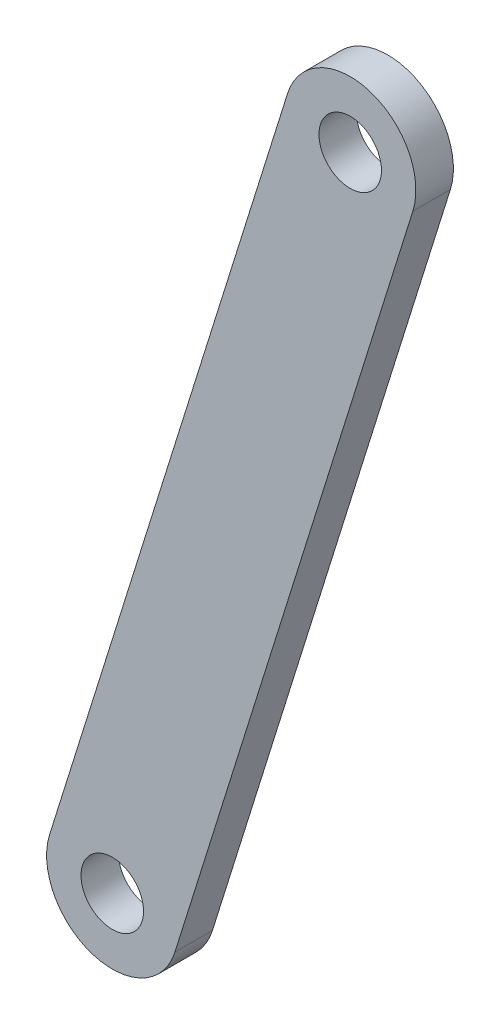
ISO-10303-21;
HEADER;
FILE_DESCRIPTION(('STEP AP214'),'2;1');
FILE_NAME('part.step','',(''),(''),'','','');
FILE_SCHEMA(('AUTOMOTIVE_DESIGN { 1 0 10303 214 1 1 1 1 }'));
ENDSEC;
DATA;
#1=APPLICATION_CONTEXT('core data for automotive mechanical design processes');
#2=APPLICATION_PROTOCOL_DEFINITION('international standard','automotive_design',2000,#1);
#3=PRODUCT_CONTEXT('',#1,'mechanical');
#4=PRODUCT('Part','Part','',(#3));
#5=PRODUCT_RELATED_PRODUCT_CATEGORY('part','',(#4));
#6=PRODUCT_DEFINITION_FORMATION('','',#4);
#7=PRODUCT_DEFINITION_CONTEXT('part definition',#1,'design');
#8=PRODUCT_DEFINITION('design','',#6,#7);
#9=PRODUCT_DEFINITION_SHAPE('','',#8);
#10=(LENGTH_UNIT() NAMED_UNIT(*) SI_UNIT(.MILLI.,.METRE.));
#11=(NAMED_UNIT(*) PLANE_ANGLE_UNIT() SI_UNIT($,.RADIAN.));
#12=(NAMED_UNIT(*) SI_UNIT($,.STERADIAN.) SOLID_ANGLE_UNIT());
#13=UNCERTAINTY_MEASURE_WITH_UNIT(LENGTH_MEASURE(1.E-05),#10,'distance_accuracy_value','');
#14=(GEOMETRIC_REPRESENTATION_CONTEXT(3) GLOBAL_UNCERTAINTY_ASSIGNED_CONTEXT((#13)) GLOBAL_UNIT_ASSIGNED_CONTEXT((#10,
#11,#12)) REPRESENTATION_CONTEXT('',''));
#15=CARTESIAN_POINT('',(0.,0.,0.));
#16=DIRECTION('',(0.,0.,1.));
#17=DIRECTION('',(1.,0.,0.));
#18=AXIS2_PLACEMENT_3D('',#15,#16,#17);
#19=CARTESIAN_POINT('',(17.3965115709118,39.6154511487598,3.));
#20=DIRECTION('',(0.,0.,-1.));
#21=DIRECTION('',(-1.,0.,0.));
#22=AXIS2_PLACEMENT_3D('',#19,#20,#21);
#23=PLANE('',#22);
#24=CARTESIAN_POINT('',(17.3965115709118,39.6154511487598,3.));
#25=DIRECTION('',(0.,0.,1.));
#26=DIRECTION('',(-1.,0.,0.));
#27=AXIS2_PLACEMENT_3D('',#24,#25,#26);
#28=CIRCLE('',#27,5.24999999999972);
#29=CARTESIAN_POINT('',(22.4071204466286,38.0481928118592,3.));
#30=VERTEX_POINT('',#29);
#31=CARTESIAN_POINT('',(12.3859026951949,41.1827094856604,3.));
#32=VERTEX_POINT('',#31);
#33=EDGE_CURVE('E95',#30,#32,#28,.T.);
#34=ORIENTED_EDGE('',*,*,#33,.T.);
#35=DIRECTION('',(-0.298525397504892,-0.954401690612787,0.));
#36=VECTOR('',#35,1.);
#37=CARTESIAN_POINT('',(12.3859026951949,41.1827094856604,3.));
#38=LINE('',#37,#36);
#39=CARTESIAN_POINT('',(-6.63982561669762,-19.6435633131633,3.));
#40=VERTEX_POINT('',#39);
#41=EDGE_CURVE('E90',#32,#40,#38,.T.);
#42=ORIENTED_EDGE('',*,*,#41,.T.);
#43=CARTESIAN_POINT('',(-1.62921674098074,-21.210821650064,3.));
#44=DIRECTION('',(0.,0.,1.));
#45=DIRECTION('',(1.,0.,0.));
#46=AXIS2_PLACEMENT_3D('',#43,#44,#45);
#47=CIRCLE('',#46,5.24999999999979);
#48=CARTESIAN_POINT('',(3.38139213473613,-22.7780799869648,3.));
#49=VERTEX_POINT('',#48);
#50=EDGE_CURVE('E93',#40,#49,#47,.T.);
#51=ORIENTED_EDGE('',*,*,#50,.T.);
#52=DIRECTION('',(0.29852539750489,0.954401690612788,0.));
#53=VECTOR('',#52,1.);
#54=CARTESIAN_POINT('',(3.38139213473613,-22.7780799869648,3.));
#55=LINE('',#54,#53);
#56=EDGE_CURVE('E60',#49,#30,#55,.T.);
#57=ORIENTED_EDGE('',*,*,#56,.T.);
#58=EDGE_LOOP('',(#34,#42,#51,#57));
#59=FACE_BOUND('',#58,.T.);
#60=CARTESIAN_POINT('',(17.3965115709118,39.6154511487598,3.));
#61=DIRECTION('',(0.,0.,1.));
#62=DIRECTION('',(1.,0.,0.));
#63=AXIS2_PLACEMENT_3D('',#60,#61,#62);
#64=CIRCLE('',#63,2.50000000000015);
#65=CARTESIAN_POINT('',(19.8965115709119,39.6154511487598,3.));
#66=VERTEX_POINT('',#65);
#67=EDGE_CURVE('E115',#66,#66,#64,.T.);
#68=ORIENTED_EDGE('',*,*,#67,.F.);
#69=EDGE_LOOP('',(#68));
#70=FACE_BOUND('',#69,.T.);
#71=CARTESIAN_POINT('',(-1.62921674098074,-21.210821650064,3.));
#72=DIRECTION('',(0.,0.,1.));
#73=DIRECTION('',(1.,0.,0.));
#74=AXIS2_PLACEMENT_3D('',#71,#72,#73);
#75=CIRCLE('',#74,2.5);
#76=CARTESIAN_POINT('',(0.870783259019253,-21.210821650064,3.));
#77=VERTEX_POINT('',#76);
#78=EDGE_CURVE('E137',#77,#77,#75,.T.);
#79=ORIENTED_EDGE('',*,*,#78,.F.);
#80=EDGE_LOOP('',(#79));
#81=FACE_BOUND('',#80,.T.);
#82=ADVANCED_FACE('F42',(#59,#70,#81),#23,.F.);
#83=CARTESIAN_POINT('',(17.3965115709118,39.6154511487598,0.));
#84=DIRECTION('',(0.,0.,-1.));
#85=DIRECTION('',(-1.,0.,0.));
#86=AXIS2_PLACEMENT_3D('',#83,#84,#85);
#87=PLANE('',#86);
#88=CARTESIAN_POINT('',(17.3965115709118,39.6154511487598,0.));
#89=DIRECTION('',(0.,0.,1.));
#90=DIRECTION('',(1.,0.,0.));
#91=AXIS2_PLACEMENT_3D('',#88,#89,#90);
#92=CIRCLE('',#91,2.50000000000015);
#93=CARTESIAN_POINT('',(19.8965115709119,39.6154511487598,0.));
#94=VERTEX_POINT('',#93);
#95=EDGE_CURVE('E133',#94,#94,#92,.T.);
#96=ORIENTED_EDGE('',*,*,#95,.T.);
#97=EDGE_LOOP('',(#96));
#98=FACE_BOUND('',#97,.T.);
#99=CARTESIAN_POINT('',(17.3965115709118,39.6154511487598,0.));
#100=DIRECTION('',(0.,0.,1.));
#101=DIRECTION('',(-1.,0.,0.));
#102=AXIS2_PLACEMENT_3D('',#99,#100,#101);
#103=CIRCLE('',#102,5.24999999999972);
#104=CARTESIAN_POINT('',(22.4071204466286,38.0481928118592,0.));
#105=VERTEX_POINT('',#104);
#106=CARTESIAN_POINT('',(12.3859026951949,41.1827094856604,0.));
#107=VERTEX_POINT('',#106);
#108=EDGE_CURVE('E111',#105,#107,#103,.T.);
#109=ORIENTED_EDGE('',*,*,#108,.F.);
#110=DIRECTION('',(0.29852539750489,0.954401690612788,0.));
#111=VECTOR('',#110,1.);
#112=CARTESIAN_POINT('',(3.38139213473613,-22.7780799869648,0.));
#113=LINE('',#112,#111);
#114=CARTESIAN_POINT('',(3.38139213473613,-22.7780799869648,0.));
#115=VERTEX_POINT('',#114);
#116=EDGE_CURVE('E83',#115,#105,#113,.T.);
#117=ORIENTED_EDGE('',*,*,#116,.F.);
#118=CARTESIAN_POINT('',(-1.62921674098074,-21.210821650064,0.));
#119=DIRECTION('',(0.,0.,1.));
#120=DIRECTION('',(1.,0.,0.));
#121=AXIS2_PLACEMENT_3D('',#118,#119,#120);
#122=CIRCLE('',#121,5.24999999999979);
#123=CARTESIAN_POINT('',(-6.63982561669762,-19.6435633131633,0.));
#124=VERTEX_POINT('',#123);
#125=EDGE_CURVE('E77',#124,#115,#122,.T.);
#126=ORIENTED_EDGE('',*,*,#125,.F.);
#127=DIRECTION('',(-0.298525397504892,-0.954401690612787,0.));
#128=VECTOR('',#127,1.);
#129=CARTESIAN_POINT('',(12.3859026951949,41.1827094856604,0.));
#130=LINE('',#129,#128);
#131=EDGE_CURVE('E100',#107,#124,#130,.T.);
#132=ORIENTED_EDGE('',*,*,#131,.F.);
#133=EDGE_LOOP('',(#109,#117,#126,#132));
#134=FACE_BOUND('',#133,.T.);
#135=CARTESIAN_POINT('',(-1.62921674098074,-21.210821650064,0.));
#136=DIRECTION('',(0.,0.,1.));
#137=DIRECTION('',(1.,0.,0.));
#138=AXIS2_PLACEMENT_3D('',#135,#136,#137);
#139=CIRCLE('',#138,2.5);
#140=CARTESIAN_POINT('',(0.870783259019253,-21.210821650064,0.));
#141=VERTEX_POINT('',#140);
#142=EDGE_CURVE('E141',#141,#141,#139,.T.);
#143=ORIENTED_EDGE('',*,*,#142,.T.);
#144=EDGE_LOOP('',(#143));
#145=FACE_BOUND('',#144,.T.);
#146=ADVANCED_FACE('F128',(#98,#134,#145),#87,.T.);
#147=CARTESIAN_POINT('',(17.3965115709118,39.6154511487598,3.));
#148=DIRECTION('',(0.,0.,-1.));
#149=DIRECTION('',(-1.,0.,0.));
#150=AXIS2_PLACEMENT_3D('',#147,#148,#149);
#151=CYLINDRICAL_SURFACE('',#150,5.24999999999972);
#152=ORIENTED_EDGE('',*,*,#108,.T.);
#153=DIRECTION('',(0.,0.,-1.));
#154=VECTOR('',#153,1.);
#155=CARTESIAN_POINT('',(12.3859026951949,41.1827094856604,3.));
#156=LINE('',#155,#154);
#157=EDGE_CURVE('E11',#32,#107,#156,.T.);
#158=ORIENTED_EDGE('',*,*,#157,.F.);
#159=ORIENTED_EDGE('',*,*,#33,.F.);
#160=DIRECTION('',(0.,0.,-1.));
#161=VECTOR('',#160,1.);
#162=CARTESIAN_POINT('',(22.4071204466286,38.0481928118592,3.));
#163=LINE('',#162,#161);
#164=EDGE_CURVE('E107',#30,#105,#163,.T.);
#165=ORIENTED_EDGE('',*,*,#164,.T.);
#166=EDGE_LOOP('',(#152,#158,#159,#165));
#167=FACE_BOUND('',#166,.T.);
#168=ADVANCED_FACE('F44',(#167),#151,.T.);
#169=CARTESIAN_POINT('',(12.3859026951949,41.1827094856604,3.));
#170=DIRECTION('',(0.954401690612787,-0.298525397504892,0.));
#171=DIRECTION('',(0.298525397504892,0.954401690612787,0.));
#172=AXIS2_PLACEMENT_3D('',#169,#170,#171);
#173=PLANE('',#172);
#174=ORIENTED_EDGE('',*,*,#131,.T.);
#175=DIRECTION('',(0.,0.,-1.));
#176=VECTOR('',#175,1.);
#177=CARTESIAN_POINT('',(-6.63982561669762,-19.6435633131633,3.));
#178=LINE('',#177,#176);
#179=EDGE_CURVE('E52',#40,#124,#178,.T.);
#180=ORIENTED_EDGE('',*,*,#179,.F.);
#181=ORIENTED_EDGE('',*,*,#41,.F.);
#182=ORIENTED_EDGE('',*,*,#157,.T.);
#183=EDGE_LOOP('',(#174,#180,#181,#182));
#184=FACE_BOUND('',#183,.T.);
#185=ADVANCED_FACE('F99',(#184),#173,.F.);
#186=CARTESIAN_POINT('',(-1.62921674098074,-21.210821650064,3.));
#187=DIRECTION('',(0.,0.,-1.));
#188=DIRECTION('',(-1.,0.,0.));
#189=AXIS2_PLACEMENT_3D('',#186,#187,#188);
#190=CYLINDRICAL_SURFACE('',#189,5.24999999999979);
#191=ORIENTED_EDGE('',*,*,#125,.T.);
#192=DIRECTION('',(0.,0.,-1.));
#193=VECTOR('',#192,1.);
#194=CARTESIAN_POINT('',(3.38139213473613,-22.7780799869648,3.));
#195=LINE('',#194,#193);
#196=EDGE_CURVE('E102',#49,#115,#195,.T.);
#197=ORIENTED_EDGE('',*,*,#196,.F.);
#198=ORIENTED_EDGE('',*,*,#50,.F.);
#199=ORIENTED_EDGE('',*,*,#179,.T.);
#200=EDGE_LOOP('',(#191,#197,#198,#199));
#201=FACE_BOUND('',#200,.T.);
#202=ADVANCED_FACE('F103',(#201),#190,.T.);
#203=CARTESIAN_POINT('',(3.38139213473613,-22.7780799869648,3.));
#204=DIRECTION('',(-0.954401690612788,0.29852539750489,0.));
#205=DIRECTION('',(-0.29852539750489,-0.954401690612788,0.));
#206=AXIS2_PLACEMENT_3D('',#203,#204,#205);
#207=PLANE('',#206);
#208=ORIENTED_EDGE('',*,*,#116,.T.);
#209=ORIENTED_EDGE('',*,*,#164,.F.);
#210=ORIENTED_EDGE('',*,*,#56,.F.);
#211=ORIENTED_EDGE('',*,*,#196,.T.);
#212=EDGE_LOOP('',(#208,#209,#210,#211));
#213=FACE_BOUND('',#212,.T.);
#214=ADVANCED_FACE('F125',(#213),#207,.F.);
#215=CARTESIAN_POINT('',(17.3965115709118,39.6154511487598,3.));
#216=DIRECTION('',(0.,0.,-1.));
#217=DIRECTION('',(-1.,0.,0.));
#218=AXIS2_PLACEMENT_3D('',#215,#216,#217);
#219=CYLINDRICAL_SURFACE('',#218,2.50000000000015);
#220=ORIENTED_EDGE('',*,*,#67,.T.);
#221=EDGE_LOOP('',(#220));
#222=FACE_BOUND('',#221,.T.);
#223=ORIENTED_EDGE('',*,*,#95,.F.);
#224=EDGE_LOOP('',(#223));
#225=FACE_BOUND('',#224,.T.);
#226=ADVANCED_FACE('F160',(#222,#225),#219,.F.);
#227=CARTESIAN_POINT('',(-1.62921674098074,-21.210821650064,3.));
#228=DIRECTION('',(0.,0.,-1.));
#229=DIRECTION('',(-1.,0.,0.));
#230=AXIS2_PLACEMENT_3D('',#227,#228,#229);
#231=CYLINDRICAL_SURFACE('',#230,2.5);
#232=ORIENTED_EDGE('',*,*,#78,.T.);
#233=EDGE_LOOP('',(#232));
#234=FACE_BOUND('',#233,.T.);
#235=ORIENTED_EDGE('',*,*,#142,.F.);
#236=EDGE_LOOP('',(#235));
#237=FACE_BOUND('',#236,.T.);
#238=ADVANCED_FACE('F149',(#234,#237),#231,.F.);
#239=CLOSED_SHELL('',(#82,#146,#168,#185,#202,#214,#226,#238));
#240=MANIFOLD_SOLID_BREP('B2',#239);
#241=ADVANCED_BREP_SHAPE_REPRESENTATION('',(#18,#240),#14);
#242=SHAPE_DEFINITION_REPRESENTATION(#9,#241);
ENDSEC;
END-ISO-10303-21;
